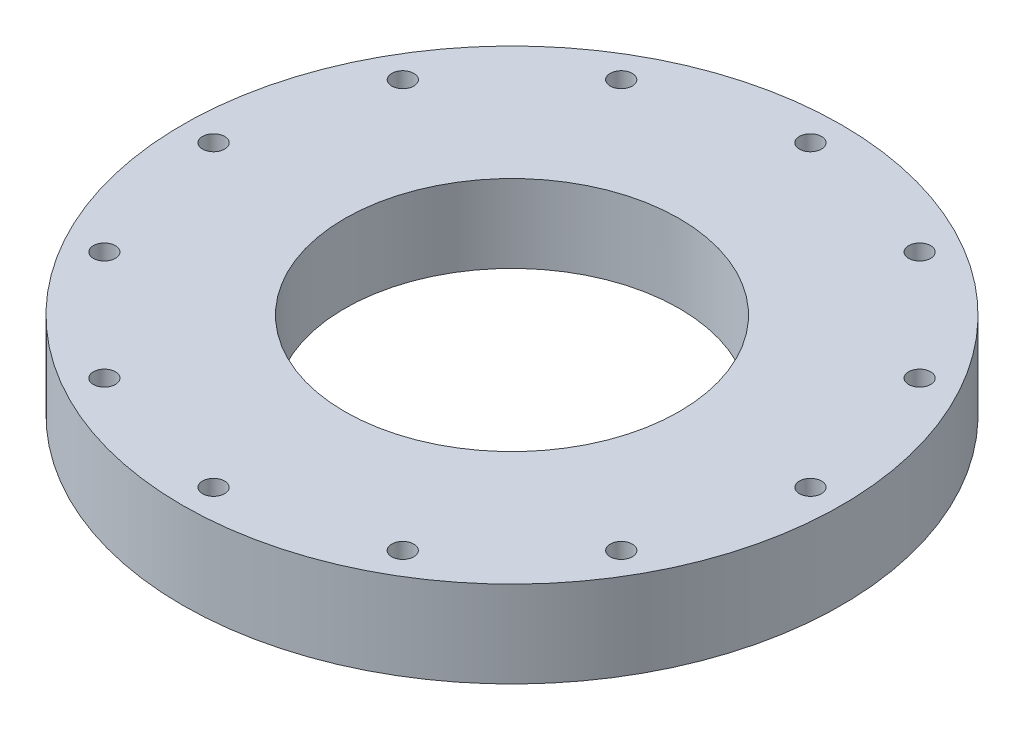
ISO-10303-21;
HEADER;
FILE_DESCRIPTION(('STEP AP214'),'2;1');
FILE_NAME('part.step','',(''),(''),'','','');
FILE_SCHEMA(('AUTOMOTIVE_DESIGN { 1 0 10303 214 1 1 1 1 }'));
ENDSEC;
DATA;
#1=APPLICATION_CONTEXT('core data for automotive mechanical design processes');
#2=APPLICATION_PROTOCOL_DEFINITION('international standard','automotive_design',2000,#1);
#3=PRODUCT_CONTEXT('',#1,'mechanical');
#4=PRODUCT('Part','Part','',(#3));
#5=PRODUCT_RELATED_PRODUCT_CATEGORY('part','',(#4));
#6=PRODUCT_DEFINITION_FORMATION('','',#4);
#7=PRODUCT_DEFINITION_CONTEXT('part definition',#1,'design');
#8=PRODUCT_DEFINITION('design','',#6,#7);
#9=PRODUCT_DEFINITION_SHAPE('','',#8);
#10=(LENGTH_UNIT() NAMED_UNIT(*) SI_UNIT(.MILLI.,.METRE.));
#11=(NAMED_UNIT(*) PLANE_ANGLE_UNIT() SI_UNIT($,.RADIAN.));
#12=(NAMED_UNIT(*) SI_UNIT($,.STERADIAN.) SOLID_ANGLE_UNIT());
#13=UNCERTAINTY_MEASURE_WITH_UNIT(LENGTH_MEASURE(1.E-05),#10,'distance_accuracy_value','');
#14=(GEOMETRIC_REPRESENTATION_CONTEXT(3) GLOBAL_UNCERTAINTY_ASSIGNED_CONTEXT((#13)) GLOBAL_UNIT_ASSIGNED_CONTEXT((#10,
#11,#12)) REPRESENTATION_CONTEXT('',''));
#15=CARTESIAN_POINT('',(0.,0.,0.));
#16=DIRECTION('',(0.,0.,1.));
#17=DIRECTION('',(1.,0.,0.));
#18=AXIS2_PLACEMENT_3D('',#15,#16,#17);
#19=CARTESIAN_POINT('',(0.,20.,0.));
#20=DIRECTION('',(0.,-1.,0.));
#21=DIRECTION('',(0.,0.,-1.));
#22=AXIS2_PLACEMENT_3D('',#19,#20,#21);
#23=CYLINDRICAL_SURFACE('',#22,38.6715);
#24=CARTESIAN_POINT('',(0.,20.,0.));
#25=DIRECTION('',(0.,1.,0.));
#26=DIRECTION('',(0.,0.,1.));
#27=AXIS2_PLACEMENT_3D('',#24,#25,#26);
#28=CIRCLE('',#27,38.6715);
#29=CARTESIAN_POINT('',(0.,20.,38.6715));
#30=VERTEX_POINT('',#29);
#31=EDGE_CURVE('E48',#30,#30,#28,.T.);
#32=ORIENTED_EDGE('',*,*,#31,.T.);
#33=EDGE_LOOP('',(#32));
#34=FACE_BOUND('',#33,.T.);
#35=CARTESIAN_POINT('',(0.,2.,0.));
#36=DIRECTION('',(0.,-1.,0.));
#37=DIRECTION('',(0.,0.,-1.));
#38=AXIS2_PLACEMENT_3D('',#35,#36,#37);
#39=CIRCLE('',#38,38.6715);
#40=CARTESIAN_POINT('',(0.,2.,-38.6715));
#41=VERTEX_POINT('',#40);
#42=EDGE_CURVE('E39',#41,#41,#39,.T.);
#43=ORIENTED_EDGE('',*,*,#42,.T.);
#44=EDGE_LOOP('',(#43));
#45=FACE_BOUND('',#44,.T.);
#46=ADVANCED_FACE('F35',(#34,#45),#23,.F.);
#47=CARTESIAN_POINT('',(0.,0.,0.));
#48=DIRECTION('',(0.,1.,0.));
#49=DIRECTION('',(0.,0.,1.));
#50=AXIS2_PLACEMENT_3D('',#47,#48,#49);
#51=PLANE('',#50);
#52=CARTESIAN_POINT('',(0.,0.,0.));
#53=DIRECTION('',(0.,-1.,0.));
#54=DIRECTION('',(0.,0.,-1.));
#55=AXIS2_PLACEMENT_3D('',#52,#53,#54);
#56=CIRCLE('',#55,55.14);
#57=CARTESIAN_POINT('',(0.,0.,-55.14));
#58=VERTEX_POINT('',#57);
#59=EDGE_CURVE('E128',#58,#58,#56,.T.);
#60=ORIENTED_EDGE('',*,*,#59,.F.);
#61=EDGE_LOOP('',(#60));
#62=FACE_BOUND('',#61,.T.);
#63=CARTESIAN_POINT('',(59.7557528611262,0.,-34.5000000000001));
#64=DIRECTION('',(0.,-1.,0.));
#65=DIRECTION('',(0.,0.,-1.));
#66=AXIS2_PLACEMENT_3D('',#63,#64,#65);
#67=CIRCLE('',#66,2.55269999999994);
#68=CARTESIAN_POINT('',(59.7557528611262,0.,-37.0527));
#69=VERTEX_POINT('',#68);
#70=EDGE_CURVE('E119',#69,#69,#67,.T.);
#71=ORIENTED_EDGE('',*,*,#70,.F.);
#72=EDGE_LOOP('',(#71));
#73=FACE_BOUND('',#72,.T.);
#74=CARTESIAN_POINT('',(34.4999999999999,0.,-59.7557528611264));
#75=DIRECTION('',(0.,-1.,0.));
#76=DIRECTION('',(0.,0.,-1.));
#77=AXIS2_PLACEMENT_3D('',#74,#75,#76);
#78=CIRCLE('',#77,2.55269999999994);
#79=CARTESIAN_POINT('',(34.4999999999999,0.,-62.3084528611263));
#80=VERTEX_POINT('',#79);
#81=EDGE_CURVE('E113',#80,#80,#78,.T.);
#82=ORIENTED_EDGE('',*,*,#81,.F.);
#83=EDGE_LOOP('',(#82));
#84=FACE_BOUND('',#83,.T.);
#85=CARTESIAN_POINT('',(-2.40912212380176E-13,0.,-69.));
#86=DIRECTION('',(0.,-1.,0.));
#87=DIRECTION('',(0.,0.,-1.));
#88=AXIS2_PLACEMENT_3D('',#85,#86,#87);
#89=CIRCLE('',#88,2.55269999999995);
#90=CARTESIAN_POINT('',(-2.40912212380176E-13,0.,-71.5527));
#91=VERTEX_POINT('',#90);
#92=EDGE_CURVE('E107',#91,#91,#89,.T.);
#93=ORIENTED_EDGE('',*,*,#92,.F.);
#94=EDGE_LOOP('',(#93));
#95=FACE_BOUND('',#94,.T.);
#96=CARTESIAN_POINT('',(-34.5000000000003,0.,-59.7557528611261));
#97=DIRECTION('',(0.,-1.,0.));
#98=DIRECTION('',(0.,0.,-1.));
#99=AXIS2_PLACEMENT_3D('',#96,#97,#98);
#100=CIRCLE('',#99,2.55269999999994);
#101=CARTESIAN_POINT('',(-34.5000000000003,0.,-62.3084528611261));
#102=VERTEX_POINT('',#101);
#103=EDGE_CURVE('E101',#102,#102,#100,.T.);
#104=ORIENTED_EDGE('',*,*,#103,.F.);
#105=EDGE_LOOP('',(#104));
#106=FACE_BOUND('',#105,.T.);
#107=CARTESIAN_POINT('',(-59.7557528611265,0.,-34.4999999999997));
#108=DIRECTION('',(0.,-1.,0.));
#109=DIRECTION('',(0.,0.,-1.));
#110=AXIS2_PLACEMENT_3D('',#107,#108,#109);
#111=CIRCLE('',#110,2.55269999999994);
#112=CARTESIAN_POINT('',(-59.7557528611265,0.,-37.0526999999996));
#113=VERTEX_POINT('',#112);
#114=EDGE_CURVE('E95',#113,#113,#111,.T.);
#115=ORIENTED_EDGE('',*,*,#114,.F.);
#116=EDGE_LOOP('',(#115));
#117=FACE_BOUND('',#116,.T.);
#118=CARTESIAN_POINT('',(-69.,0.,4.81824424760352E-13));
#119=DIRECTION('',(0.,-1.,0.));
#120=DIRECTION('',(0.,0.,-1.));
#121=AXIS2_PLACEMENT_3D('',#118,#119,#120);
#122=CIRCLE('',#121,2.55269999999995);
#123=CARTESIAN_POINT('',(-69.,0.,-2.55269999999947));
#124=VERTEX_POINT('',#123);
#125=EDGE_CURVE('E89',#124,#124,#122,.T.);
#126=ORIENTED_EDGE('',*,*,#125,.F.);
#127=EDGE_LOOP('',(#126));
#128=FACE_BOUND('',#127,.T.);
#129=CARTESIAN_POINT('',(-59.755752861126,0.,34.5000000000005));
#130=DIRECTION('',(0.,-1.,0.));
#131=DIRECTION('',(0.,0.,-1.));
#132=AXIS2_PLACEMENT_3D('',#129,#130,#131);
#133=CIRCLE('',#132,2.55269999999994);
#134=CARTESIAN_POINT('',(-59.755752861126,0.,31.9473000000006));
#135=VERTEX_POINT('',#134);
#136=EDGE_CURVE('E83',#135,#135,#133,.T.);
#137=ORIENTED_EDGE('',*,*,#136,.F.);
#138=EDGE_LOOP('',(#137));
#139=FACE_BOUND('',#138,.T.);
#140=CARTESIAN_POINT('',(-34.4999999999994,0.,59.7557528611266));
#141=DIRECTION('',(0.,-1.,0.));
#142=DIRECTION('',(0.,0.,-1.));
#143=AXIS2_PLACEMENT_3D('',#140,#141,#142);
#144=CIRCLE('',#143,2.55269999999994);
#145=CARTESIAN_POINT('',(-34.4999999999994,0.,57.2030528611266));
#146=VERTEX_POINT('',#145);
#147=EDGE_CURVE('E77',#146,#146,#144,.T.);
#148=ORIENTED_EDGE('',*,*,#147,.F.);
#149=EDGE_LOOP('',(#148));
#150=FACE_BOUND('',#149,.T.);
#151=CARTESIAN_POINT('',(7.22736637140529E-13,0.,69.));
#152=DIRECTION('',(0.,-1.,0.));
#153=DIRECTION('',(0.,0.,-1.));
#154=AXIS2_PLACEMENT_3D('',#151,#152,#153);
#155=CIRCLE('',#154,2.55269999999995);
#156=CARTESIAN_POINT('',(7.22736637140529E-13,0.,66.4473000000001));
#157=VERTEX_POINT('',#156);
#158=EDGE_CURVE('E71',#157,#157,#155,.T.);
#159=ORIENTED_EDGE('',*,*,#158,.F.);
#160=EDGE_LOOP('',(#159));
#161=FACE_BOUND('',#160,.T.);
#162=CARTESIAN_POINT('',(34.5000000000007,0.,59.7557528611259));
#163=DIRECTION('',(0.,-1.,0.));
#164=DIRECTION('',(0.,0.,-1.));
#165=AXIS2_PLACEMENT_3D('',#162,#163,#164);
#166=CIRCLE('',#165,2.55269999999994);
#167=CARTESIAN_POINT('',(34.5000000000007,0.,57.2030528611259));
#168=VERTEX_POINT('',#167);
#169=EDGE_CURVE('E63',#168,#168,#166,.T.);
#170=ORIENTED_EDGE('',*,*,#169,.F.);
#171=EDGE_LOOP('',(#170));
#172=FACE_BOUND('',#171,.T.);
#173=CARTESIAN_POINT('',(59.7557528611267,0.,34.4999999999992));
#174=DIRECTION('',(0.,-1.,0.));
#175=DIRECTION('',(0.,0.,-1.));
#176=AXIS2_PLACEMENT_3D('',#173,#174,#175);
#177=CIRCLE('',#176,2.55269999999994);
#178=CARTESIAN_POINT('',(59.7557528611267,0.,31.9472999999993));
#179=VERTEX_POINT('',#178);
#180=EDGE_CURVE('E54',#179,#179,#177,.T.);
#181=ORIENTED_EDGE('',*,*,#180,.F.);
#182=EDGE_LOOP('',(#181));
#183=FACE_BOUND('',#182,.T.);
#184=CARTESIAN_POINT('',(0.,0.,0.));
#185=DIRECTION('',(0.,1.,0.));
#186=DIRECTION('',(0.,0.,1.));
#187=AXIS2_PLACEMENT_3D('',#184,#185,#186);
#188=CIRCLE('',#187,76.2);
#189=CARTESIAN_POINT('',(0.,0.,76.2));
#190=VERTEX_POINT('',#189);
#191=EDGE_CURVE('E43',#190,#190,#188,.T.);
#192=ORIENTED_EDGE('',*,*,#191,.F.);
#193=EDGE_LOOP('',(#192));
#194=FACE_BOUND('',#193,.T.);
#195=CARTESIAN_POINT('',(69.,0.,0.));
#196=DIRECTION('',(0.,-1.,0.));
#197=DIRECTION('',(0.,0.,-1.));
#198=AXIS2_PLACEMENT_3D('',#195,#196,#197);
#199=CIRCLE('',#198,2.55269999999995);
#200=CARTESIAN_POINT('',(69.,0.,-2.55269999999995));
#201=VERTEX_POINT('',#200);
#202=EDGE_CURVE('E125',#201,#201,#199,.T.);
#203=ORIENTED_EDGE('',*,*,#202,.F.);
#204=EDGE_LOOP('',(#203));
#205=FACE_BOUND('',#204,.T.);
#206=ADVANCED_FACE('F150',(#62,#73,#84,#95,#106,#117,#128,#139,#150,#161,#172,#183,#194,#205),
#51,.F.);
#207=CARTESIAN_POINT('',(0.,20.,0.));
#208=DIRECTION('',(0.,1.,0.));
#209=DIRECTION('',(0.,0.,1.));
#210=AXIS2_PLACEMENT_3D('',#207,#208,#209);
#211=PLANE('',#210);
#212=CARTESIAN_POINT('',(69.,20.,0.));
#213=DIRECTION('',(0.,1.,0.));
#214=DIRECTION('',(0.,0.,1.));
#215=AXIS2_PLACEMENT_3D('',#212,#213,#214);
#216=CIRCLE('',#215,2.55269999999995);
#217=CARTESIAN_POINT('',(69.,20.,2.55269999999995));
#218=VERTEX_POINT('',#217);
#219=EDGE_CURVE('E122',#218,#218,#216,.T.);
#220=ORIENTED_EDGE('',*,*,#219,.F.);
#221=EDGE_LOOP('',(#220));
#222=FACE_BOUND('',#221,.T.);
#223=CARTESIAN_POINT('',(59.7557528611262,20.,-34.5000000000001));
#224=DIRECTION('',(0.,1.,0.));
#225=DIRECTION('',(0.,0.,1.));
#226=AXIS2_PLACEMENT_3D('',#223,#224,#225);
#227=CIRCLE('',#226,2.55269999999994);
#228=CARTESIAN_POINT('',(59.7557528611262,20.,-31.9473000000001));
#229=VERTEX_POINT('',#228);
#230=EDGE_CURVE('E116',#229,#229,#227,.T.);
#231=ORIENTED_EDGE('',*,*,#230,.F.);
#232=EDGE_LOOP('',(#231));
#233=FACE_BOUND('',#232,.T.);
#234=CARTESIAN_POINT('',(34.4999999999999,20.,-59.7557528611264));
#235=DIRECTION('',(0.,1.,0.));
#236=DIRECTION('',(0.,0.,1.));
#237=AXIS2_PLACEMENT_3D('',#234,#235,#236);
#238=CIRCLE('',#237,2.55269999999994);
#239=CARTESIAN_POINT('',(34.4999999999999,20.,-57.2030528611264));
#240=VERTEX_POINT('',#239);
#241=EDGE_CURVE('E110',#240,#240,#238,.T.);
#242=ORIENTED_EDGE('',*,*,#241,.F.);
#243=EDGE_LOOP('',(#242));
#244=FACE_BOUND('',#243,.T.);
#245=CARTESIAN_POINT('',(-2.40912212380176E-13,20.,-69.));
#246=DIRECTION('',(0.,1.,0.));
#247=DIRECTION('',(0.,0.,1.));
#248=AXIS2_PLACEMENT_3D('',#245,#246,#247);
#249=CIRCLE('',#248,2.55269999999994);
#250=CARTESIAN_POINT('',(-2.40912212380176E-13,20.,-66.4473000000001));
#251=VERTEX_POINT('',#250);
#252=EDGE_CURVE('E104',#251,#251,#249,.T.);
#253=ORIENTED_EDGE('',*,*,#252,.F.);
#254=EDGE_LOOP('',(#253));
#255=FACE_BOUND('',#254,.T.);
#256=CARTESIAN_POINT('',(-34.5000000000003,20.,-59.7557528611261));
#257=DIRECTION('',(0.,1.,0.));
#258=DIRECTION('',(0.,0.,1.));
#259=AXIS2_PLACEMENT_3D('',#256,#257,#258);
#260=CIRCLE('',#259,2.55269999999994);
#261=CARTESIAN_POINT('',(-34.5000000000003,20.,-57.2030528611262));
#262=VERTEX_POINT('',#261);
#263=EDGE_CURVE('E98',#262,#262,#260,.T.);
#264=ORIENTED_EDGE('',*,*,#263,.F.);
#265=EDGE_LOOP('',(#264));
#266=FACE_BOUND('',#265,.T.);
#267=CARTESIAN_POINT('',(-59.7557528611265,20.,-34.4999999999997));
#268=DIRECTION('',(0.,1.,0.));
#269=DIRECTION('',(0.,0.,1.));
#270=AXIS2_PLACEMENT_3D('',#267,#268,#269);
#271=CIRCLE('',#270,2.55269999999994);
#272=CARTESIAN_POINT('',(-59.7557528611265,20.,-31.9472999999997));
#273=VERTEX_POINT('',#272);
#274=EDGE_CURVE('E92',#273,#273,#271,.T.);
#275=ORIENTED_EDGE('',*,*,#274,.F.);
#276=EDGE_LOOP('',(#275));
#277=FACE_BOUND('',#276,.T.);
#278=CARTESIAN_POINT('',(-69.,20.,4.81824424760352E-13));
#279=DIRECTION('',(0.,1.,0.));
#280=DIRECTION('',(0.,0.,1.));
#281=AXIS2_PLACEMENT_3D('',#278,#279,#280);
#282=CIRCLE('',#281,2.55269999999995);
#283=CARTESIAN_POINT('',(-69.,20.,2.55270000000043));
#284=VERTEX_POINT('',#283);
#285=EDGE_CURVE('E86',#284,#284,#282,.T.);
#286=ORIENTED_EDGE('',*,*,#285,.F.);
#287=EDGE_LOOP('',(#286));
#288=FACE_BOUND('',#287,.T.);
#289=CARTESIAN_POINT('',(-59.755752861126,20.,34.5000000000005));
#290=DIRECTION('',(0.,1.,0.));
#291=DIRECTION('',(0.,0.,1.));
#292=AXIS2_PLACEMENT_3D('',#289,#290,#291);
#293=CIRCLE('',#292,2.55269999999994);
#294=CARTESIAN_POINT('',(-59.755752861126,20.,37.0527000000004));
#295=VERTEX_POINT('',#294);
#296=EDGE_CURVE('E80',#295,#295,#293,.T.);
#297=ORIENTED_EDGE('',*,*,#296,.F.);
#298=EDGE_LOOP('',(#297));
#299=FACE_BOUND('',#298,.T.);
#300=CARTESIAN_POINT('',(-34.4999999999994,20.,59.7557528611266));
#301=DIRECTION('',(0.,1.,0.));
#302=DIRECTION('',(0.,0.,1.));
#303=AXIS2_PLACEMENT_3D('',#300,#301,#302);
#304=CIRCLE('',#303,2.55269999999994);
#305=CARTESIAN_POINT('',(-34.4999999999994,20.,62.3084528611265));
#306=VERTEX_POINT('',#305);
#307=EDGE_CURVE('E74',#306,#306,#304,.T.);
#308=ORIENTED_EDGE('',*,*,#307,.F.);
#309=EDGE_LOOP('',(#308));
#310=FACE_BOUND('',#309,.T.);
#311=CARTESIAN_POINT('',(7.22736637140529E-13,20.,69.));
#312=DIRECTION('',(0.,1.,0.));
#313=DIRECTION('',(0.,0.,1.));
#314=AXIS2_PLACEMENT_3D('',#311,#312,#313);
#315=CIRCLE('',#314,2.55269999999994);
#316=CARTESIAN_POINT('',(7.22736637140529E-13,20.,71.5527));
#317=VERTEX_POINT('',#316);
#318=EDGE_CURVE('E68',#317,#317,#315,.T.);
#319=ORIENTED_EDGE('',*,*,#318,.F.);
#320=EDGE_LOOP('',(#319));
#321=FACE_BOUND('',#320,.T.);
#322=CARTESIAN_POINT('',(34.5000000000007,20.,59.7557528611259));
#323=DIRECTION('',(0.,1.,0.));
#324=DIRECTION('',(0.,0.,1.));
#325=AXIS2_PLACEMENT_3D('',#322,#323,#324);
#326=CIRCLE('',#325,2.55269999999994);
#327=CARTESIAN_POINT('',(34.5000000000007,20.,62.3084528611258));
#328=VERTEX_POINT('',#327);
#329=EDGE_CURVE('E59',#328,#328,#326,.T.);
#330=ORIENTED_EDGE('',*,*,#329,.F.);
#331=EDGE_LOOP('',(#330));
#332=FACE_BOUND('',#331,.T.);
#333=CARTESIAN_POINT('',(59.7557528611267,20.,34.4999999999992));
#334=DIRECTION('',(0.,1.,0.));
#335=DIRECTION('',(0.,0.,1.));
#336=AXIS2_PLACEMENT_3D('',#333,#334,#335);
#337=CIRCLE('',#336,2.55269999999994);
#338=CARTESIAN_POINT('',(59.7557528611267,20.,37.0526999999992));
#339=VERTEX_POINT('',#338);
#340=EDGE_CURVE('E52',#339,#339,#337,.T.);
#341=ORIENTED_EDGE('',*,*,#340,.F.);
#342=EDGE_LOOP('',(#341));
#343=FACE_BOUND('',#342,.T.);
#344=CARTESIAN_POINT('',(0.,20.,0.));
#345=DIRECTION('',(0.,1.,0.));
#346=DIRECTION('',(0.,0.,1.));
#347=AXIS2_PLACEMENT_3D('',#344,#345,#346);
#348=CIRCLE('',#347,76.2);
#349=CARTESIAN_POINT('',(0.,20.,76.2));
#350=VERTEX_POINT('',#349);
#351=EDGE_CURVE('E10',#350,#350,#348,.T.);
#352=ORIENTED_EDGE('',*,*,#351,.T.);
#353=EDGE_LOOP('',(#352));
#354=FACE_BOUND('',#353,.T.);
#355=ORIENTED_EDGE('',*,*,#31,.F.);
#356=EDGE_LOOP('',(#355));
#357=FACE_BOUND('',#356,.T.);
#358=ADVANCED_FACE('F156',(#222,#233,#244,#255,#266,#277,#288,#299,#310,#321,#332,#343,#354,
#357),#211,.T.);
#359=CARTESIAN_POINT('',(0.,20.,0.));
#360=DIRECTION('',(0.,-1.,0.));
#361=DIRECTION('',(0.,0.,-1.));
#362=AXIS2_PLACEMENT_3D('',#359,#360,#361);
#363=CYLINDRICAL_SURFACE('',#362,76.2);
#364=ORIENTED_EDGE('',*,*,#351,.F.);
#365=EDGE_LOOP('',(#364));
#366=FACE_BOUND('',#365,.T.);
#367=ORIENTED_EDGE('',*,*,#191,.T.);
#368=EDGE_LOOP('',(#367));
#369=FACE_BOUND('',#368,.T.);
#370=ADVANCED_FACE('F37',(#366,#369),#363,.T.);
#371=CARTESIAN_POINT('',(59.7557528611267,0.,34.4999999999992));
#372=DIRECTION('',(0.,-1.,0.));
#373=DIRECTION('',(0.,0.,-1.));
#374=AXIS2_PLACEMENT_3D('',#371,#372,#373);
#375=CYLINDRICAL_SURFACE('',#374,2.55269999999994);
#376=ORIENTED_EDGE('',*,*,#340,.T.);
#377=EDGE_LOOP('',(#376));
#378=FACE_BOUND('',#377,.T.);
#379=ORIENTED_EDGE('',*,*,#180,.T.);
#380=EDGE_LOOP('',(#379));
#381=FACE_BOUND('',#380,.T.);
#382=ADVANCED_FACE('F160',(#378,#381),#375,.F.);
#383=CARTESIAN_POINT('',(34.5000000000007,0.,59.7557528611259));
#384=DIRECTION('',(0.,-1.,0.));
#385=DIRECTION('',(0.,0.,-1.));
#386=AXIS2_PLACEMENT_3D('',#383,#384,#385);
#387=CYLINDRICAL_SURFACE('',#386,2.55269999999994);
#388=ORIENTED_EDGE('',*,*,#329,.T.);
#389=EDGE_LOOP('',(#388));
#390=FACE_BOUND('',#389,.T.);
#391=ORIENTED_EDGE('',*,*,#169,.T.);
#392=EDGE_LOOP('',(#391));
#393=FACE_BOUND('',#392,.T.);
#394=ADVANCED_FACE('F193',(#390,#393),#387,.F.);
#395=CARTESIAN_POINT('',(7.22736637140529E-13,0.,69.));
#396=DIRECTION('',(0.,-1.,0.));
#397=DIRECTION('',(0.,0.,-1.));
#398=AXIS2_PLACEMENT_3D('',#395,#396,#397);
#399=CYLINDRICAL_SURFACE('',#398,2.55269999999994);
#400=ORIENTED_EDGE('',*,*,#318,.T.);
#401=EDGE_LOOP('',(#400));
#402=FACE_BOUND('',#401,.T.);
#403=ORIENTED_EDGE('',*,*,#158,.T.);
#404=EDGE_LOOP('',(#403));
#405=FACE_BOUND('',#404,.T.);
#406=ADVANCED_FACE('F196',(#402,#405),#399,.F.);
#407=CARTESIAN_POINT('',(-34.4999999999994,0.,59.7557528611266));
#408=DIRECTION('',(0.,-1.,0.));
#409=DIRECTION('',(0.,0.,-1.));
#410=AXIS2_PLACEMENT_3D('',#407,#408,#409);
#411=CYLINDRICAL_SURFACE('',#410,2.55269999999994);
#412=ORIENTED_EDGE('',*,*,#307,.T.);
#413=EDGE_LOOP('',(#412));
#414=FACE_BOUND('',#413,.T.);
#415=ORIENTED_EDGE('',*,*,#147,.T.);
#416=EDGE_LOOP('',(#415));
#417=FACE_BOUND('',#416,.T.);
#418=ADVANCED_FACE('F238',(#414,#417),#411,.F.);
#419=CARTESIAN_POINT('',(-59.755752861126,0.,34.5000000000005));
#420=DIRECTION('',(0.,-1.,0.));
#421=DIRECTION('',(0.,0.,-1.));
#422=AXIS2_PLACEMENT_3D('',#419,#420,#421);
#423=CYLINDRICAL_SURFACE('',#422,2.55269999999994);
#424=ORIENTED_EDGE('',*,*,#296,.T.);
#425=EDGE_LOOP('',(#424));
#426=FACE_BOUND('',#425,.T.);
#427=ORIENTED_EDGE('',*,*,#136,.T.);
#428=EDGE_LOOP('',(#427));
#429=FACE_BOUND('',#428,.T.);
#430=ADVANCED_FACE('F234',(#426,#429),#423,.F.);
#431=CARTESIAN_POINT('',(-69.,0.,4.81824424760352E-13));
#432=DIRECTION('',(0.,-1.,0.));
#433=DIRECTION('',(0.,0.,-1.));
#434=AXIS2_PLACEMENT_3D('',#431,#432,#433);
#435=CYLINDRICAL_SURFACE('',#434,2.55269999999995);
#436=ORIENTED_EDGE('',*,*,#285,.T.);
#437=EDGE_LOOP('',(#436));
#438=FACE_BOUND('',#437,.T.);
#439=ORIENTED_EDGE('',*,*,#125,.T.);
#440=EDGE_LOOP('',(#439));
#441=FACE_BOUND('',#440,.T.);
#442=ADVANCED_FACE('F230',(#438,#441),#435,.F.);
#443=CARTESIAN_POINT('',(-59.7557528611265,0.,-34.4999999999997));
#444=DIRECTION('',(0.,-1.,0.));
#445=DIRECTION('',(0.,0.,-1.));
#446=AXIS2_PLACEMENT_3D('',#443,#444,#445);
#447=CYLINDRICAL_SURFACE('',#446,2.55269999999994);
#448=ORIENTED_EDGE('',*,*,#274,.T.);
#449=EDGE_LOOP('',(#448));
#450=FACE_BOUND('',#449,.T.);
#451=ORIENTED_EDGE('',*,*,#114,.T.);
#452=EDGE_LOOP('',(#451));
#453=FACE_BOUND('',#452,.T.);
#454=ADVANCED_FACE('F226',(#450,#453),#447,.F.);
#455=CARTESIAN_POINT('',(-34.5000000000003,0.,-59.7557528611261));
#456=DIRECTION('',(0.,-1.,0.));
#457=DIRECTION('',(0.,0.,-1.));
#458=AXIS2_PLACEMENT_3D('',#455,#456,#457);
#459=CYLINDRICAL_SURFACE('',#458,2.55269999999994);
#460=ORIENTED_EDGE('',*,*,#263,.T.);
#461=EDGE_LOOP('',(#460));
#462=FACE_BOUND('',#461,.T.);
#463=ORIENTED_EDGE('',*,*,#103,.T.);
#464=EDGE_LOOP('',(#463));
#465=FACE_BOUND('',#464,.T.);
#466=ADVANCED_FACE('F222',(#462,#465),#459,.F.);
#467=CARTESIAN_POINT('',(-2.40912212380176E-13,0.,-69.));
#468=DIRECTION('',(0.,-1.,0.));
#469=DIRECTION('',(0.,0.,-1.));
#470=AXIS2_PLACEMENT_3D('',#467,#468,#469);
#471=CYLINDRICAL_SURFACE('',#470,2.55269999999994);
#472=ORIENTED_EDGE('',*,*,#252,.T.);
#473=EDGE_LOOP('',(#472));
#474=FACE_BOUND('',#473,.T.);
#475=ORIENTED_EDGE('',*,*,#92,.T.);
#476=EDGE_LOOP('',(#475));
#477=FACE_BOUND('',#476,.T.);
#478=ADVANCED_FACE('F218',(#474,#477),#471,.F.);
#479=CARTESIAN_POINT('',(34.4999999999999,0.,-59.7557528611264));
#480=DIRECTION('',(0.,-1.,0.));
#481=DIRECTION('',(0.,0.,-1.));
#482=AXIS2_PLACEMENT_3D('',#479,#480,#481);
#483=CYLINDRICAL_SURFACE('',#482,2.55269999999994);
#484=ORIENTED_EDGE('',*,*,#241,.T.);
#485=EDGE_LOOP('',(#484));
#486=FACE_BOUND('',#485,.T.);
#487=ORIENTED_EDGE('',*,*,#81,.T.);
#488=EDGE_LOOP('',(#487));
#489=FACE_BOUND('',#488,.T.);
#490=ADVANCED_FACE('F212',(#486,#489),#483,.F.);
#491=CARTESIAN_POINT('',(59.7557528611262,0.,-34.5000000000001));
#492=DIRECTION('',(0.,-1.,0.));
#493=DIRECTION('',(0.,0.,-1.));
#494=AXIS2_PLACEMENT_3D('',#491,#492,#493);
#495=CYLINDRICAL_SURFACE('',#494,2.55269999999994);
#496=ORIENTED_EDGE('',*,*,#230,.T.);
#497=EDGE_LOOP('',(#496));
#498=FACE_BOUND('',#497,.T.);
#499=ORIENTED_EDGE('',*,*,#70,.T.);
#500=EDGE_LOOP('',(#499));
#501=FACE_BOUND('',#500,.T.);
#502=ADVANCED_FACE('F206',(#498,#501),#495,.F.);
#503=CARTESIAN_POINT('',(69.,0.,0.));
#504=DIRECTION('',(0.,-1.,0.));
#505=DIRECTION('',(0.,0.,-1.));
#506=AXIS2_PLACEMENT_3D('',#503,#504,#505);
#507=CYLINDRICAL_SURFACE('',#506,2.55269999999995);
#508=ORIENTED_EDGE('',*,*,#219,.T.);
#509=EDGE_LOOP('',(#508));
#510=FACE_BOUND('',#509,.T.);
#511=ORIENTED_EDGE('',*,*,#202,.T.);
#512=EDGE_LOOP('',(#511));
#513=FACE_BOUND('',#512,.T.);
#514=ADVANCED_FACE('F146',(#510,#513),#507,.F.);
#515=CARTESIAN_POINT('',(0.,2.,0.));
#516=DIRECTION('',(0.,-1.,0.));
#517=DIRECTION('',(0.,0.,-1.));
#518=AXIS2_PLACEMENT_3D('',#515,#516,#517);
#519=CYLINDRICAL_SURFACE('',#518,55.14);
#520=CARTESIAN_POINT('',(0.,2.,0.));
#521=DIRECTION('',(0.,-1.,0.));
#522=DIRECTION('',(0.,0.,-1.));
#523=AXIS2_PLACEMENT_3D('',#520,#521,#522);
#524=CIRCLE('',#523,55.14);
#525=CARTESIAN_POINT('',(0.,2.,-55.14));
#526=VERTEX_POINT('',#525);
#527=EDGE_CURVE('E131',#526,#526,#524,.T.);
#528=ORIENTED_EDGE('',*,*,#527,.F.);
#529=EDGE_LOOP('',(#528));
#530=FACE_BOUND('',#529,.T.);
#531=ORIENTED_EDGE('',*,*,#59,.T.);
#532=EDGE_LOOP('',(#531));
#533=FACE_BOUND('',#532,.T.);
#534=ADVANCED_FACE('F141',(#530,#533),#519,.F.);
#535=CARTESIAN_POINT('',(0.,2.,0.));
#536=DIRECTION('',(0.,-1.,0.));
#537=DIRECTION('',(0.,0.,-1.));
#538=AXIS2_PLACEMENT_3D('',#535,#536,#537);
#539=PLANE('',#538);
#540=ORIENTED_EDGE('',*,*,#42,.F.);
#541=EDGE_LOOP('',(#540));
#542=FACE_BOUND('',#541,.T.);
#543=ORIENTED_EDGE('',*,*,#527,.T.);
#544=EDGE_LOOP('',(#543));
#545=FACE_BOUND('',#544,.T.);
#546=ADVANCED_FACE('F139',(#542,#545),#539,.T.);
#547=CLOSED_SHELL('',(#46,#206,#358,#370,#382,#394,#406,#418,#430,#442,#454,#466,#478,#490,#502,
#514,#534,#546));
#548=MANIFOLD_SOLID_BREP('B2',#547);
#549=ADVANCED_BREP_SHAPE_REPRESENTATION('',(#18,#548),#14);
#550=SHAPE_DEFINITION_REPRESENTATION(#9,#549);
ENDSEC;
END-ISO-10303-21;
